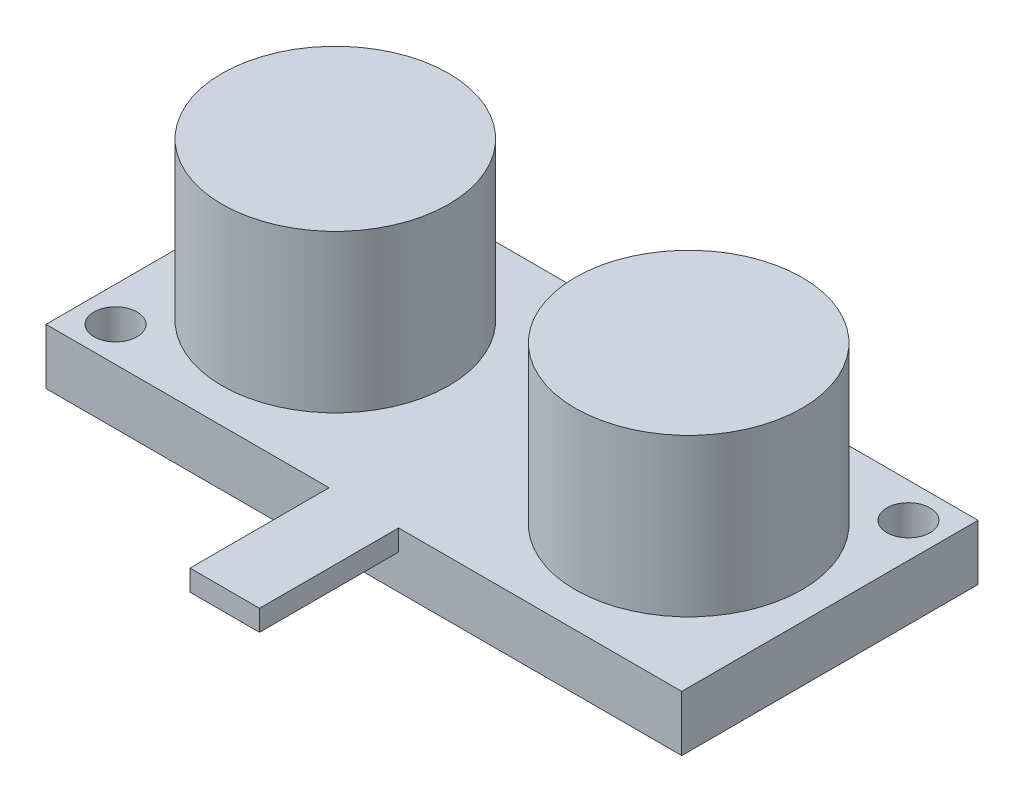
ISO-10303-21;
HEADER;
FILE_DESCRIPTION(('STEP AP214'),'2;1');
FILE_NAME('part.step','',(''),(''),'','','');
FILE_SCHEMA(('AUTOMOTIVE_DESIGN { 1 0 10303 214 1 1 1 1 }'));
ENDSEC;
DATA;
#1=APPLICATION_CONTEXT('core data for automotive mechanical design processes');
#2=APPLICATION_PROTOCOL_DEFINITION('international standard','automotive_design',2000,#1);
#3=PRODUCT_CONTEXT('',#1,'mechanical');
#4=PRODUCT('Part','Part','',(#3));
#5=PRODUCT_RELATED_PRODUCT_CATEGORY('part','',(#4));
#6=PRODUCT_DEFINITION_FORMATION('','',#4);
#7=PRODUCT_DEFINITION_CONTEXT('part definition',#1,'design');
#8=PRODUCT_DEFINITION('design','',#6,#7);
#9=PRODUCT_DEFINITION_SHAPE('','',#8);
#10=(LENGTH_UNIT() NAMED_UNIT(*) SI_UNIT(.MILLI.,.METRE.));
#11=(NAMED_UNIT(*) PLANE_ANGLE_UNIT() SI_UNIT($,.RADIAN.));
#12=(NAMED_UNIT(*) SI_UNIT($,.STERADIAN.) SOLID_ANGLE_UNIT());
#13=UNCERTAINTY_MEASURE_WITH_UNIT(LENGTH_MEASURE(1.E-05),#10,'distance_accuracy_value','');
#14=(GEOMETRIC_REPRESENTATION_CONTEXT(3) GLOBAL_UNCERTAINTY_ASSIGNED_CONTEXT((#13)) GLOBAL_UNIT_ASSIGNED_CONTEXT((#10,
#11,#12)) REPRESENTATION_CONTEXT('',''));
#15=CARTESIAN_POINT('',(0.,0.,0.));
#16=DIRECTION('',(0.,0.,1.));
#17=DIRECTION('',(1.,0.,0.));
#18=AXIS2_PLACEMENT_3D('',#15,#16,#17);
#19=CARTESIAN_POINT('',(0.,4.,0.));
#20=DIRECTION('',(0.,0.,-1.));
#21=DIRECTION('',(-1.,0.,0.));
#22=AXIS2_PLACEMENT_3D('',#19,#20,#21);
#23=PLANE('',#22);
#24=DIRECTION('',(0.,-1.,0.));
#25=VECTOR('',#24,1.);
#26=CARTESIAN_POINT('',(20.35,2.5,0.));
#27=LINE('',#26,#25);
#28=CARTESIAN_POINT('',(20.35,4.,0.));
#29=VERTEX_POINT('',#28);
#30=CARTESIAN_POINT('',(20.35,2.5,0.));
#31=VERTEX_POINT('',#30);
#32=EDGE_CURVE('E120',#29,#31,#27,.T.);
#33=ORIENTED_EDGE('',*,*,#32,.F.);
#34=DIRECTION('',(1.,0.,0.));
#35=VECTOR('',#34,1.);
#36=CARTESIAN_POINT('',(0.,4.,0.));
#37=LINE('',#36,#35);
#38=CARTESIAN_POINT('',(0.,4.,0.));
#39=VERTEX_POINT('',#38);
#40=EDGE_CURVE('E163',#39,#29,#37,.T.);
#41=ORIENTED_EDGE('',*,*,#40,.F.);
#42=DIRECTION('',(0.,-1.,0.));
#43=VECTOR('',#42,1.);
#44=CARTESIAN_POINT('',(0.,4.,0.));
#45=LINE('',#44,#43);
#46=CARTESIAN_POINT('',(0.,0.,0.));
#47=VERTEX_POINT('',#46);
#48=EDGE_CURVE('E11',#39,#47,#45,.T.);
#49=ORIENTED_EDGE('',*,*,#48,.T.);
#50=DIRECTION('',(1.,0.,0.));
#51=VECTOR('',#50,1.);
#52=CARTESIAN_POINT('',(0.,0.,0.));
#53=LINE('',#52,#51);
#54=CARTESIAN_POINT('',(45.7,0.,0.));
#55=VERTEX_POINT('',#54);
#56=EDGE_CURVE('E178',#47,#55,#53,.T.);
#57=ORIENTED_EDGE('',*,*,#56,.T.);
#58=DIRECTION('',(0.,-1.,0.));
#59=VECTOR('',#58,1.);
#60=CARTESIAN_POINT('',(45.7,4.,0.));
#61=LINE('',#60,#59);
#62=CARTESIAN_POINT('',(45.7,4.,0.));
#63=VERTEX_POINT('',#62);
#64=EDGE_CURVE('E41',#63,#55,#61,.T.);
#65=ORIENTED_EDGE('',*,*,#64,.F.);
#66=CARTESIAN_POINT('',(25.35,4.,0.));
#67=VERTEX_POINT('',#66);
#68=EDGE_CURVE('E55',#67,#63,#37,.T.);
#69=ORIENTED_EDGE('',*,*,#68,.F.);
#70=DIRECTION('',(0.,1.,0.));
#71=VECTOR('',#70,1.);
#72=CARTESIAN_POINT('',(25.35,4.,0.));
#73=LINE('',#72,#71);
#74=CARTESIAN_POINT('',(25.35,2.5,0.));
#75=VERTEX_POINT('',#74);
#76=EDGE_CURVE('E117',#75,#67,#73,.T.);
#77=ORIENTED_EDGE('',*,*,#76,.F.);
#78=DIRECTION('',(1.,0.,0.));
#79=VECTOR('',#78,1.);
#80=CARTESIAN_POINT('',(25.35,2.5,0.));
#81=LINE('',#80,#79);
#82=EDGE_CURVE('E49',#31,#75,#81,.T.);
#83=ORIENTED_EDGE('',*,*,#82,.F.);
#84=EDGE_LOOP('',(#33,#41,#49,#57,#65,#69,#77,#83));
#85=FACE_BOUND('',#84,.T.);
#86=ADVANCED_FACE('F32',(#85),#23,.F.);
#87=CARTESIAN_POINT('',(0.,4.,0.));
#88=DIRECTION('',(0.,1.,0.));
#89=DIRECTION('',(0.,0.,1.));
#90=AXIS2_PLACEMENT_3D('',#87,#88,#89);
#91=PLANE('',#90);
#92=CARTESIAN_POINT('',(35.55,4.,-10.65));
#93=DIRECTION('',(0.,1.,0.));
#94=DIRECTION('',(0.,0.,1.));
#95=AXIS2_PLACEMENT_3D('',#92,#93,#94);
#96=CIRCLE('',#95,8.15);
#97=CARTESIAN_POINT('',(35.55,4.,-18.8));
#98=VERTEX_POINT('',#97);
#99=EDGE_CURVE('E131',#98,#98,#96,.T.);
#100=ORIENTED_EDGE('',*,*,#99,.F.);
#101=EDGE_LOOP('',(#100));
#102=FACE_BOUND('',#101,.T.);
#103=CARTESIAN_POINT('',(43.2,4.,-18.8));
#104=DIRECTION('',(0.,1.,0.));
#105=DIRECTION('',(0.,0.,1.));
#106=AXIS2_PLACEMENT_3D('',#103,#104,#105);
#107=CIRCLE('',#106,1.55);
#108=CARTESIAN_POINT('',(43.2,4.,-17.25));
#109=VERTEX_POINT('',#108);
#110=EDGE_CURVE('E145',#109,#109,#107,.T.);
#111=ORIENTED_EDGE('',*,*,#110,.F.);
#112=EDGE_LOOP('',(#111));
#113=FACE_BOUND('',#112,.T.);
#114=DIRECTION('',(0.,0.,1.));
#115=VECTOR('',#114,1.);
#116=CARTESIAN_POINT('',(0.,4.,-21.3));
#117=LINE('',#116,#115);
#118=CARTESIAN_POINT('',(0.,4.,-21.3));
#119=VERTEX_POINT('',#118);
#120=EDGE_CURVE('E151',#119,#39,#117,.T.);
#121=ORIENTED_EDGE('',*,*,#120,.T.);
#122=ORIENTED_EDGE('',*,*,#40,.T.);
#123=DIRECTION('',(0.,0.,-1.));
#124=VECTOR('',#123,1.);
#125=CARTESIAN_POINT('',(20.35,4.,10.));
#126=LINE('',#125,#124);
#127=CARTESIAN_POINT('',(20.35,4.,10.));
#128=VERTEX_POINT('',#127);
#129=EDGE_CURVE('E199',#128,#29,#126,.T.);
#130=ORIENTED_EDGE('',*,*,#129,.F.);
#131=DIRECTION('',(-1.,0.,0.));
#132=VECTOR('',#131,1.);
#133=CARTESIAN_POINT('',(20.35,4.,10.));
#134=LINE('',#133,#132);
#135=CARTESIAN_POINT('',(25.35,4.,10.));
#136=VERTEX_POINT('',#135);
#137=EDGE_CURVE('E113',#136,#128,#134,.T.);
#138=ORIENTED_EDGE('',*,*,#137,.F.);
#139=DIRECTION('',(0.,0.,-1.));
#140=VECTOR('',#139,1.);
#141=CARTESIAN_POINT('',(25.35,4.,10.));
#142=LINE('',#141,#140);
#143=EDGE_CURVE('E126',#136,#67,#142,.T.);
#144=ORIENTED_EDGE('',*,*,#143,.T.);
#145=ORIENTED_EDGE('',*,*,#68,.T.);
#146=DIRECTION('',(0.,0.,-1.));
#147=VECTOR('',#146,1.);
#148=CARTESIAN_POINT('',(45.7,4.,0.));
#149=LINE('',#148,#147);
#150=CARTESIAN_POINT('',(45.7,4.,-21.3));
#151=VERTEX_POINT('',#150);
#152=EDGE_CURVE('E157',#63,#151,#149,.T.);
#153=ORIENTED_EDGE('',*,*,#152,.T.);
#154=DIRECTION('',(-1.,0.,0.));
#155=VECTOR('',#154,1.);
#156=CARTESIAN_POINT('',(45.7,4.,-21.3));
#157=LINE('',#156,#155);
#158=EDGE_CURVE('E174',#151,#119,#157,.T.);
#159=ORIENTED_EDGE('',*,*,#158,.T.);
#160=EDGE_LOOP('',(#121,#122,#130,#138,#144,#145,#153,#159));
#161=FACE_BOUND('',#160,.T.);
#162=CARTESIAN_POINT('',(2.5,4.,-2.5));
#163=DIRECTION('',(0.,1.,0.));
#164=DIRECTION('',(0.,0.,1.));
#165=AXIS2_PLACEMENT_3D('',#162,#163,#164);
#166=CIRCLE('',#165,1.55);
#167=CARTESIAN_POINT('',(2.5,4.,-0.95));
#168=VERTEX_POINT('',#167);
#169=EDGE_CURVE('E139',#168,#168,#166,.T.);
#170=ORIENTED_EDGE('',*,*,#169,.F.);
#171=EDGE_LOOP('',(#170));
#172=FACE_BOUND('',#171,.T.);
#173=CARTESIAN_POINT('',(10.15,4.,-10.65));
#174=DIRECTION('',(0.,1.,0.));
#175=DIRECTION('',(0.,0.,1.));
#176=AXIS2_PLACEMENT_3D('',#173,#174,#175);
#177=CIRCLE('',#176,8.15);
#178=CARTESIAN_POINT('',(10.15,4.,-18.8));
#179=VERTEX_POINT('',#178);
#180=EDGE_CURVE('E121',#179,#179,#177,.T.);
#181=ORIENTED_EDGE('',*,*,#180,.F.);
#182=EDGE_LOOP('',(#181));
#183=FACE_BOUND('',#182,.T.);
#184=ADVANCED_FACE('F186',(#102,#113,#161,#172,#183),#91,.T.);
#185=CARTESIAN_POINT('',(0.,0.,0.));
#186=DIRECTION('',(0.,1.,0.));
#187=DIRECTION('',(0.,0.,1.));
#188=AXIS2_PLACEMENT_3D('',#185,#186,#187);
#189=PLANE('',#188);
#190=CARTESIAN_POINT('',(43.2,0.,-18.8));
#191=DIRECTION('',(0.,1.,0.));
#192=DIRECTION('',(0.,0.,1.));
#193=AXIS2_PLACEMENT_3D('',#190,#191,#192);
#194=CIRCLE('',#193,1.55);
#195=CARTESIAN_POINT('',(43.2,0.,-17.25));
#196=VERTEX_POINT('',#195);
#197=EDGE_CURVE('E142',#196,#196,#194,.T.);
#198=ORIENTED_EDGE('',*,*,#197,.T.);
#199=EDGE_LOOP('',(#198));
#200=FACE_BOUND('',#199,.T.);
#201=DIRECTION('',(0.,0.,1.));
#202=VECTOR('',#201,1.);
#203=CARTESIAN_POINT('',(0.,0.,-21.3));
#204=LINE('',#203,#202);
#205=CARTESIAN_POINT('',(0.,0.,-21.3));
#206=VERTEX_POINT('',#205);
#207=EDGE_CURVE('E148',#206,#47,#204,.T.);
#208=ORIENTED_EDGE('',*,*,#207,.F.);
#209=DIRECTION('',(-1.,0.,0.));
#210=VECTOR('',#209,1.);
#211=CARTESIAN_POINT('',(45.7,0.,-21.3));
#212=LINE('',#211,#210);
#213=CARTESIAN_POINT('',(45.7,0.,-21.3));
#214=VERTEX_POINT('',#213);
#215=EDGE_CURVE('E154',#214,#206,#212,.T.);
#216=ORIENTED_EDGE('',*,*,#215,.F.);
#217=DIRECTION('',(0.,0.,-1.));
#218=VECTOR('',#217,1.);
#219=CARTESIAN_POINT('',(45.7,0.,0.));
#220=LINE('',#219,#218);
#221=EDGE_CURVE('E176',#55,#214,#220,.T.);
#222=ORIENTED_EDGE('',*,*,#221,.F.);
#223=ORIENTED_EDGE('',*,*,#56,.F.);
#224=EDGE_LOOP('',(#208,#216,#222,#223));
#225=FACE_BOUND('',#224,.T.);
#226=CARTESIAN_POINT('',(2.5,0.,-2.5));
#227=DIRECTION('',(0.,1.,0.));
#228=DIRECTION('',(0.,0.,1.));
#229=AXIS2_PLACEMENT_3D('',#226,#227,#228);
#230=CIRCLE('',#229,1.55);
#231=CARTESIAN_POINT('',(2.5,0.,-0.95));
#232=VERTEX_POINT('',#231);
#233=EDGE_CURVE('E136',#232,#232,#230,.T.);
#234=ORIENTED_EDGE('',*,*,#233,.T.);
#235=EDGE_LOOP('',(#234));
#236=FACE_BOUND('',#235,.T.);
#237=ADVANCED_FACE('F217',(#200,#225,#236),#189,.F.);
#238=CARTESIAN_POINT('',(0.,4.,-21.3));
#239=DIRECTION('',(1.,0.,0.));
#240=DIRECTION('',(0.,0.,-1.));
#241=AXIS2_PLACEMENT_3D('',#238,#239,#240);
#242=PLANE('',#241);
#243=ORIENTED_EDGE('',*,*,#207,.T.);
#244=ORIENTED_EDGE('',*,*,#48,.F.);
#245=ORIENTED_EDGE('',*,*,#120,.F.);
#246=DIRECTION('',(0.,-1.,0.));
#247=VECTOR('',#246,1.);
#248=CARTESIAN_POINT('',(0.,4.,-21.3));
#249=LINE('',#248,#247);
#250=EDGE_CURVE('E171',#119,#206,#249,.T.);
#251=ORIENTED_EDGE('',*,*,#250,.T.);
#252=EDGE_LOOP('',(#243,#244,#245,#251));
#253=FACE_BOUND('',#252,.T.);
#254=ADVANCED_FACE('F34',(#253),#242,.F.);
#255=CARTESIAN_POINT('',(45.7,4.,0.));
#256=DIRECTION('',(-1.,0.,0.));
#257=DIRECTION('',(0.,0.,1.));
#258=AXIS2_PLACEMENT_3D('',#255,#256,#257);
#259=PLANE('',#258);
#260=ORIENTED_EDGE('',*,*,#221,.T.);
#261=DIRECTION('',(0.,-1.,0.));
#262=VECTOR('',#261,1.);
#263=CARTESIAN_POINT('',(45.7,4.,-21.3));
#264=LINE('',#263,#262);
#265=EDGE_CURVE('E168',#151,#214,#264,.T.);
#266=ORIENTED_EDGE('',*,*,#265,.F.);
#267=ORIENTED_EDGE('',*,*,#152,.F.);
#268=ORIENTED_EDGE('',*,*,#64,.T.);
#269=EDGE_LOOP('',(#260,#266,#267,#268));
#270=FACE_BOUND('',#269,.T.);
#271=ADVANCED_FACE('F190',(#270),#259,.F.);
#272=CARTESIAN_POINT('',(45.7,4.,-21.3));
#273=DIRECTION('',(0.,0.,1.));
#274=DIRECTION('',(1.,0.,0.));
#275=AXIS2_PLACEMENT_3D('',#272,#273,#274);
#276=PLANE('',#275);
#277=ORIENTED_EDGE('',*,*,#215,.T.);
#278=ORIENTED_EDGE('',*,*,#250,.F.);
#279=ORIENTED_EDGE('',*,*,#158,.F.);
#280=ORIENTED_EDGE('',*,*,#265,.T.);
#281=EDGE_LOOP('',(#277,#278,#279,#280));
#282=FACE_BOUND('',#281,.T.);
#283=ADVANCED_FACE('F194',(#282),#276,.F.);
#284=CARTESIAN_POINT('',(43.2,4.,-18.8));
#285=DIRECTION('',(0.,-1.,0.));
#286=DIRECTION('',(0.,0.,-1.));
#287=AXIS2_PLACEMENT_3D('',#284,#285,#286);
#288=CYLINDRICAL_SURFACE('',#287,1.55);
#289=ORIENTED_EDGE('',*,*,#110,.T.);
#290=EDGE_LOOP('',(#289));
#291=FACE_BOUND('',#290,.T.);
#292=ORIENTED_EDGE('',*,*,#197,.F.);
#293=EDGE_LOOP('',(#292));
#294=FACE_BOUND('',#293,.T.);
#295=ADVANCED_FACE('F225',(#291,#294),#288,.F.);
#296=CARTESIAN_POINT('',(2.5,4.,-2.5));
#297=DIRECTION('',(0.,-1.,0.));
#298=DIRECTION('',(0.,0.,-1.));
#299=AXIS2_PLACEMENT_3D('',#296,#297,#298);
#300=CYLINDRICAL_SURFACE('',#299,1.55);
#301=ORIENTED_EDGE('',*,*,#169,.T.);
#302=EDGE_LOOP('',(#301));
#303=FACE_BOUND('',#302,.T.);
#304=ORIENTED_EDGE('',*,*,#233,.F.);
#305=EDGE_LOOP('',(#304));
#306=FACE_BOUND('',#305,.T.);
#307=ADVANCED_FACE('F231',(#303,#306),#300,.F.);
#308=CARTESIAN_POINT('',(35.55,15.3,-10.65));
#309=DIRECTION('',(0.,-1.,0.));
#310=DIRECTION('',(0.,0.,-1.));
#311=AXIS2_PLACEMENT_3D('',#308,#309,#310);
#312=CYLINDRICAL_SURFACE('',#311,8.15);
#313=CARTESIAN_POINT('',(35.55,15.3,-10.65));
#314=DIRECTION('',(0.,1.,0.));
#315=DIRECTION('',(0.,0.,1.));
#316=AXIS2_PLACEMENT_3D('',#313,#314,#315);
#317=CIRCLE('',#316,8.15);
#318=CARTESIAN_POINT('',(35.55,15.3,-18.8));
#319=VERTEX_POINT('',#318);
#320=EDGE_CURVE('E133',#319,#319,#317,.T.);
#321=CARTESIAN_POINT('',(35.55,15.3,-18.8));
#322=CARTESIAN_POINT('',(35.55,15.1822916666667,-18.8));
#323=CARTESIAN_POINT('',(35.55,15.0645833333333,-18.8));
#324=CARTESIAN_POINT('',(35.55,14.8291666666667,-18.8));
#325=CARTESIAN_POINT('',(35.55,14.7114583333333,-18.8));
#326=CARTESIAN_POINT('',(35.55,14.4760416666667,-18.8));
#327=CARTESIAN_POINT('',(35.55,14.3583333333333,-18.8));
#328=CARTESIAN_POINT('',(35.55,14.1229166666667,-18.8));
#329=CARTESIAN_POINT('',(35.55,14.0052083333333,-18.8));
#330=CARTESIAN_POINT('',(35.55,13.7697916666667,-18.8));
#331=CARTESIAN_POINT('',(35.55,13.6520833333333,-18.8));
#332=CARTESIAN_POINT('',(35.55,13.4166666666667,-18.8));
#333=CARTESIAN_POINT('',(35.55,13.2989583333333,-18.8));
#334=CARTESIAN_POINT('',(35.55,13.0635416666667,-18.8));
#335=CARTESIAN_POINT('',(35.55,12.9458333333333,-18.8));
#336=CARTESIAN_POINT('',(35.55,12.7104166666667,-18.8));
#337=CARTESIAN_POINT('',(35.55,12.5927083333333,-18.8));
#338=CARTESIAN_POINT('',(35.55,12.3572916666667,-18.8));
#339=CARTESIAN_POINT('',(35.55,12.2395833333333,-18.8));
#340=CARTESIAN_POINT('',(35.55,12.0041666666667,-18.8));
#341=CARTESIAN_POINT('',(35.55,11.8864583333333,-18.8));
#342=CARTESIAN_POINT('',(35.55,11.6510416666667,-18.8));
#343=CARTESIAN_POINT('',(35.55,11.5333333333333,-18.8));
#344=CARTESIAN_POINT('',(35.55,11.2979166666667,-18.8));
#345=CARTESIAN_POINT('',(35.55,11.1802083333333,-18.8));
#346=CARTESIAN_POINT('',(35.55,10.9447916666667,-18.8));
#347=CARTESIAN_POINT('',(35.55,10.8270833333333,-18.8));
#348=CARTESIAN_POINT('',(35.55,10.5916666666667,-18.8));
#349=CARTESIAN_POINT('',(35.55,10.4739583333333,-18.8));
#350=CARTESIAN_POINT('',(35.55,10.2385416666667,-18.8));
#351=CARTESIAN_POINT('',(35.55,10.1208333333333,-18.8));
#352=CARTESIAN_POINT('',(35.55,9.88541666666667,-18.8));
#353=CARTESIAN_POINT('',(35.55,9.76770833333333,-18.8));
#354=CARTESIAN_POINT('',(35.55,9.53229166666667,-18.8));
#355=CARTESIAN_POINT('',(35.55,9.41458333333333,-18.8));
#356=CARTESIAN_POINT('',(35.55,9.17916666666667,-18.8));
#357=CARTESIAN_POINT('',(35.55,9.06145833333333,-18.8));
#358=CARTESIAN_POINT('',(35.55,8.82604166666667,-18.8));
#359=CARTESIAN_POINT('',(35.55,8.70833333333333,-18.8));
#360=CARTESIAN_POINT('',(35.55,8.47291666666667,-18.8));
#361=CARTESIAN_POINT('',(35.55,8.35520833333333,-18.8));
#362=CARTESIAN_POINT('',(35.55,8.11979166666667,-18.8));
#363=CARTESIAN_POINT('',(35.55,8.00208333333333,-18.8));
#364=CARTESIAN_POINT('',(35.55,7.76666666666667,-18.8));
#365=CARTESIAN_POINT('',(35.55,7.64895833333333,-18.8));
#366=CARTESIAN_POINT('',(35.55,7.41354166666667,-18.8));
#367=CARTESIAN_POINT('',(35.55,7.29583333333333,-18.8));
#368=CARTESIAN_POINT('',(35.55,7.06041666666667,-18.8));
#369=CARTESIAN_POINT('',(35.55,6.94270833333333,-18.8));
#370=CARTESIAN_POINT('',(35.55,6.70729166666667,-18.8));
#371=CARTESIAN_POINT('',(35.55,6.58958333333333,-18.8));
#372=CARTESIAN_POINT('',(35.55,6.35416666666667,-18.8));
#373=CARTESIAN_POINT('',(35.55,6.23645833333333,-18.8));
#374=CARTESIAN_POINT('',(35.55,6.00104166666667,-18.8));
#375=CARTESIAN_POINT('',(35.55,5.88333333333333,-18.8));
#376=CARTESIAN_POINT('',(35.55,5.64791666666667,-18.8));
#377=CARTESIAN_POINT('',(35.55,5.53020833333333,-18.8));
#378=CARTESIAN_POINT('',(35.55,5.29479166666667,-18.8));
#379=CARTESIAN_POINT('',(35.55,5.17708333333333,-18.8));
#380=CARTESIAN_POINT('',(35.55,4.94166666666667,-18.8));
#381=CARTESIAN_POINT('',(35.55,4.82395833333333,-18.8));
#382=CARTESIAN_POINT('',(35.55,4.58854166666667,-18.8));
#383=CARTESIAN_POINT('',(35.55,4.47083333333333,-18.8));
#384=CARTESIAN_POINT('',(35.55,4.23541666666667,-18.8));
#385=CARTESIAN_POINT('',(35.55,4.11770833333333,-18.8));
#386=CARTESIAN_POINT('',(35.55,4.,-18.8));
#387=B_SPLINE_CURVE_WITH_KNOTS('',3,(#321,#322,#323,#324,#325,#326,#327,#328,#329,#330,#331,
#332,#333,#334,#335,#336,#337,#338,#339,#340,#341,#342,#343,#344,#345,#346,#347,#348,#349,#350,
#351,#352,#353,#354,#355,#356,#357,#358,#359,#360,#361,#362,#363,#364,#365,#366,#367,#368,#369,
#370,#371,#372,#373,#374,#375,#376,#377,#378,#379,#380,#381,#382,#383,#384,#385,#386),
.UNSPECIFIED.,.F.,.F.,(4,2,2,2,2,2,2,2,2,2,2,2,2,2,2,2,2,2,2,2,2,2,2,2,2,2,2,2,2,2,2,2,4),(0.,
0.353124999999999,0.706249999999998,1.059375,1.4125,1.765625,2.11875,2.471875,2.825,3.178125,
3.53125,3.884375,4.2375,4.590625,4.94375,5.296875,5.65,6.003125,6.35625,6.709375,7.0625,
7.415625,7.76875,8.121875,8.475,8.828125,9.18125,9.534375,9.8875,10.240625,10.59375,10.946875,
11.3),.UNSPECIFIED.);
#388=EDGE_CURVE('BSEAM235',#319,#98,#387,.T.);
#389=ORIENTED_EDGE('',*,*,#320,.F.);
#390=ORIENTED_EDGE('',*,*,#99,.T.);
#391=ORIENTED_EDGE('',*,*,#388,.T.);
#392=ORIENTED_EDGE('',*,*,#388,.F.);
#393=EDGE_LOOP('',(#389,#391,#390,#392));
#394=FACE_BOUND('',#393,.T.);
#395=ADVANCED_FACE('F235',(#394),#312,.T.);
#396=CARTESIAN_POINT('',(35.55,15.3,-10.65));
#397=DIRECTION('',(0.,1.,0.));
#398=DIRECTION('',(0.,0.,1.));
#399=AXIS2_PLACEMENT_3D('',#396,#397,#398);
#400=PLANE('',#399);
#401=ORIENTED_EDGE('',*,*,#320,.T.);
#402=EDGE_LOOP('',(#401));
#403=FACE_BOUND('',#402,.T.);
#404=ADVANCED_FACE('F239',(#403),#400,.T.);
#405=CARTESIAN_POINT('',(10.15,15.3,-10.65));
#406=DIRECTION('',(0.,-1.,0.));
#407=DIRECTION('',(0.,0.,-1.));
#408=AXIS2_PLACEMENT_3D('',#405,#406,#407);
#409=CYLINDRICAL_SURFACE('',#408,8.15);
#410=CARTESIAN_POINT('',(10.15,15.3,-10.65));
#411=DIRECTION('',(0.,1.,0.));
#412=DIRECTION('',(0.,0.,1.));
#413=AXIS2_PLACEMENT_3D('',#410,#411,#412);
#414=CIRCLE('',#413,8.15);
#415=CARTESIAN_POINT('',(10.15,15.3,-18.8));
#416=VERTEX_POINT('',#415);
#417=EDGE_CURVE('E124',#416,#416,#414,.T.);
#418=CARTESIAN_POINT('',(10.15,15.3,-18.8));
#419=CARTESIAN_POINT('',(10.15,15.1822916666667,-18.8));
#420=CARTESIAN_POINT('',(10.15,15.0645833333333,-18.8));
#421=CARTESIAN_POINT('',(10.15,14.8291666666667,-18.8));
#422=CARTESIAN_POINT('',(10.15,14.7114583333333,-18.8));
#423=CARTESIAN_POINT('',(10.15,14.4760416666667,-18.8));
#424=CARTESIAN_POINT('',(10.15,14.3583333333333,-18.8));
#425=CARTESIAN_POINT('',(10.15,14.1229166666667,-18.8));
#426=CARTESIAN_POINT('',(10.15,14.0052083333333,-18.8));
#427=CARTESIAN_POINT('',(10.15,13.7697916666667,-18.8));
#428=CARTESIAN_POINT('',(10.15,13.6520833333333,-18.8));
#429=CARTESIAN_POINT('',(10.15,13.4166666666667,-18.8));
#430=CARTESIAN_POINT('',(10.15,13.2989583333333,-18.8));
#431=CARTESIAN_POINT('',(10.15,13.0635416666667,-18.8));
#432=CARTESIAN_POINT('',(10.15,12.9458333333333,-18.8));
#433=CARTESIAN_POINT('',(10.15,12.7104166666667,-18.8));
#434=CARTESIAN_POINT('',(10.15,12.5927083333333,-18.8));
#435=CARTESIAN_POINT('',(10.15,12.3572916666667,-18.8));
#436=CARTESIAN_POINT('',(10.15,12.2395833333333,-18.8));
#437=CARTESIAN_POINT('',(10.15,12.0041666666667,-18.8));
#438=CARTESIAN_POINT('',(10.15,11.8864583333333,-18.8));
#439=CARTESIAN_POINT('',(10.15,11.6510416666667,-18.8));
#440=CARTESIAN_POINT('',(10.15,11.5333333333333,-18.8));
#441=CARTESIAN_POINT('',(10.15,11.2979166666667,-18.8));
#442=CARTESIAN_POINT('',(10.15,11.1802083333333,-18.8));
#443=CARTESIAN_POINT('',(10.15,10.9447916666667,-18.8));
#444=CARTESIAN_POINT('',(10.15,10.8270833333333,-18.8));
#445=CARTESIAN_POINT('',(10.15,10.5916666666667,-18.8));
#446=CARTESIAN_POINT('',(10.15,10.4739583333333,-18.8));
#447=CARTESIAN_POINT('',(10.15,10.2385416666667,-18.8));
#448=CARTESIAN_POINT('',(10.15,10.1208333333333,-18.8));
#449=CARTESIAN_POINT('',(10.15,9.88541666666667,-18.8));
#450=CARTESIAN_POINT('',(10.15,9.76770833333333,-18.8));
#451=CARTESIAN_POINT('',(10.15,9.53229166666667,-18.8));
#452=CARTESIAN_POINT('',(10.15,9.41458333333333,-18.8));
#453=CARTESIAN_POINT('',(10.15,9.17916666666667,-18.8));
#454=CARTESIAN_POINT('',(10.15,9.06145833333333,-18.8));
#455=CARTESIAN_POINT('',(10.15,8.82604166666667,-18.8));
#456=CARTESIAN_POINT('',(10.15,8.70833333333333,-18.8));
#457=CARTESIAN_POINT('',(10.15,8.47291666666667,-18.8));
#458=CARTESIAN_POINT('',(10.15,8.35520833333333,-18.8));
#459=CARTESIAN_POINT('',(10.15,8.11979166666667,-18.8));
#460=CARTESIAN_POINT('',(10.15,8.00208333333333,-18.8));
#461=CARTESIAN_POINT('',(10.15,7.76666666666667,-18.8));
#462=CARTESIAN_POINT('',(10.15,7.64895833333333,-18.8));
#463=CARTESIAN_POINT('',(10.15,7.41354166666667,-18.8));
#464=CARTESIAN_POINT('',(10.15,7.29583333333333,-18.8));
#465=CARTESIAN_POINT('',(10.15,7.06041666666667,-18.8));
#466=CARTESIAN_POINT('',(10.15,6.94270833333333,-18.8));
#467=CARTESIAN_POINT('',(10.15,6.70729166666667,-18.8));
#468=CARTESIAN_POINT('',(10.15,6.58958333333333,-18.8));
#469=CARTESIAN_POINT('',(10.15,6.35416666666667,-18.8));
#470=CARTESIAN_POINT('',(10.15,6.23645833333333,-18.8));
#471=CARTESIAN_POINT('',(10.15,6.00104166666667,-18.8));
#472=CARTESIAN_POINT('',(10.15,5.88333333333333,-18.8));
#473=CARTESIAN_POINT('',(10.15,5.64791666666667,-18.8));
#474=CARTESIAN_POINT('',(10.15,5.53020833333333,-18.8));
#475=CARTESIAN_POINT('',(10.15,5.29479166666667,-18.8));
#476=CARTESIAN_POINT('',(10.15,5.17708333333333,-18.8));
#477=CARTESIAN_POINT('',(10.15,4.94166666666667,-18.8));
#478=CARTESIAN_POINT('',(10.15,4.82395833333333,-18.8));
#479=CARTESIAN_POINT('',(10.15,4.58854166666667,-18.8));
#480=CARTESIAN_POINT('',(10.15,4.47083333333333,-18.8));
#481=CARTESIAN_POINT('',(10.15,4.23541666666667,-18.8));
#482=CARTESIAN_POINT('',(10.15,4.11770833333333,-18.8));
#483=CARTESIAN_POINT('',(10.15,4.,-18.8));
#484=B_SPLINE_CURVE_WITH_KNOTS('',3,(#418,#419,#420,#421,#422,#423,#424,#425,#426,#427,#428,
#429,#430,#431,#432,#433,#434,#435,#436,#437,#438,#439,#440,#441,#442,#443,#444,#445,#446,#447,
#448,#449,#450,#451,#452,#453,#454,#455,#456,#457,#458,#459,#460,#461,#462,#463,#464,#465,#466,
#467,#468,#469,#470,#471,#472,#473,#474,#475,#476,#477,#478,#479,#480,#481,#482,#483),
.UNSPECIFIED.,.F.,.F.,(4,2,2,2,2,2,2,2,2,2,2,2,2,2,2,2,2,2,2,2,2,2,2,2,2,2,2,2,2,2,2,2,4),(0.,
0.353124999999999,0.706249999999998,1.059375,1.4125,1.765625,2.11875,2.471875,2.825,3.178125,
3.53125,3.884375,4.2375,4.590625,4.94375,5.296875,5.65,6.003125,6.35625,6.709375,7.0625,
7.415625,7.76875,8.121875,8.475,8.828125,9.18125,9.534375,9.8875,10.240625,10.59375,10.946875,
11.3),.UNSPECIFIED.);
#485=EDGE_CURVE('BSEAM243',#416,#179,#484,.T.);
#486=ORIENTED_EDGE('',*,*,#417,.F.);
#487=ORIENTED_EDGE('',*,*,#180,.T.);
#488=ORIENTED_EDGE('',*,*,#485,.T.);
#489=ORIENTED_EDGE('',*,*,#485,.F.);
#490=EDGE_LOOP('',(#486,#488,#487,#489));
#491=FACE_BOUND('',#490,.T.);
#492=ADVANCED_FACE('F243',(#491),#409,.T.);
#493=CARTESIAN_POINT('',(10.15,15.3,-10.65));
#494=DIRECTION('',(0.,1.,0.));
#495=DIRECTION('',(0.,0.,1.));
#496=AXIS2_PLACEMENT_3D('',#493,#494,#495);
#497=PLANE('',#496);
#498=ORIENTED_EDGE('',*,*,#417,.T.);
#499=EDGE_LOOP('',(#498));
#500=FACE_BOUND('',#499,.T.);
#501=ADVANCED_FACE('F247',(#500),#497,.T.);
#502=CARTESIAN_POINT('',(20.35,2.5,10.));
#503=DIRECTION('',(1.,0.,0.));
#504=DIRECTION('',(0.,0.,-1.));
#505=AXIS2_PLACEMENT_3D('',#502,#503,#504);
#506=PLANE('',#505);
#507=ORIENTED_EDGE('',*,*,#32,.T.);
#508=DIRECTION('',(0.,0.,-1.));
#509=VECTOR('',#508,1.);
#510=CARTESIAN_POINT('',(20.35,2.5,10.));
#511=LINE('',#510,#509);
#512=CARTESIAN_POINT('',(20.35,2.5,10.));
#513=VERTEX_POINT('',#512);
#514=EDGE_CURVE('E101',#513,#31,#511,.T.);
#515=ORIENTED_EDGE('',*,*,#514,.F.);
#516=DIRECTION('',(0.,-1.,0.));
#517=VECTOR('',#516,1.);
#518=CARTESIAN_POINT('',(20.35,2.5,10.));
#519=LINE('',#518,#517);
#520=EDGE_CURVE('E108',#128,#513,#519,.T.);
#521=ORIENTED_EDGE('',*,*,#520,.F.);
#522=ORIENTED_EDGE('',*,*,#129,.T.);
#523=EDGE_LOOP('',(#507,#515,#521,#522));
#524=FACE_BOUND('',#523,.T.);
#525=ADVANCED_FACE('F119',(#524),#506,.F.);
#526=CARTESIAN_POINT('',(25.35,2.5,10.));
#527=DIRECTION('',(0.,1.,0.));
#528=DIRECTION('',(0.,0.,1.));
#529=AXIS2_PLACEMENT_3D('',#526,#527,#528);
#530=PLANE('',#529);
#531=ORIENTED_EDGE('',*,*,#82,.T.);
#532=DIRECTION('',(0.,0.,-1.));
#533=VECTOR('',#532,1.);
#534=CARTESIAN_POINT('',(25.35,2.5,10.));
#535=LINE('',#534,#533);
#536=CARTESIAN_POINT('',(25.35,2.5,10.));
#537=VERTEX_POINT('',#536);
#538=EDGE_CURVE('E104',#537,#75,#535,.T.);
#539=ORIENTED_EDGE('',*,*,#538,.F.);
#540=DIRECTION('',(1.,0.,0.));
#541=VECTOR('',#540,1.);
#542=CARTESIAN_POINT('',(25.35,2.5,10.));
#543=LINE('',#542,#541);
#544=EDGE_CURVE('E97',#513,#537,#543,.T.);
#545=ORIENTED_EDGE('',*,*,#544,.F.);
#546=ORIENTED_EDGE('',*,*,#514,.T.);
#547=EDGE_LOOP('',(#531,#539,#545,#546));
#548=FACE_BOUND('',#547,.T.);
#549=ADVANCED_FACE('F99',(#548),#530,.F.);
#550=CARTESIAN_POINT('',(25.35,4.,10.));
#551=DIRECTION('',(-1.,0.,0.));
#552=DIRECTION('',(0.,0.,1.));
#553=AXIS2_PLACEMENT_3D('',#550,#551,#552);
#554=PLANE('',#553);
#555=ORIENTED_EDGE('',*,*,#76,.T.);
#556=ORIENTED_EDGE('',*,*,#143,.F.);
#557=DIRECTION('',(0.,1.,0.));
#558=VECTOR('',#557,1.);
#559=CARTESIAN_POINT('',(25.35,4.,10.));
#560=LINE('',#559,#558);
#561=EDGE_CURVE('E107',#537,#136,#560,.T.);
#562=ORIENTED_EDGE('',*,*,#561,.F.);
#563=ORIENTED_EDGE('',*,*,#538,.T.);
#564=EDGE_LOOP('',(#555,#556,#562,#563));
#565=FACE_BOUND('',#564,.T.);
#566=ADVANCED_FACE('F212',(#565),#554,.F.);
#567=CARTESIAN_POINT('',(20.35,4.,10.));
#568=DIRECTION('',(0.,0.,-1.));
#569=DIRECTION('',(-1.,0.,0.));
#570=AXIS2_PLACEMENT_3D('',#567,#568,#569);
#571=PLANE('',#570);
#572=ORIENTED_EDGE('',*,*,#520,.T.);
#573=ORIENTED_EDGE('',*,*,#544,.T.);
#574=ORIENTED_EDGE('',*,*,#561,.T.);
#575=ORIENTED_EDGE('',*,*,#137,.T.);
#576=EDGE_LOOP('',(#572,#573,#574,#575));
#577=FACE_BOUND('',#576,.T.);
#578=ADVANCED_FACE('F111',(#577),#571,.F.);
#579=CLOSED_SHELL('',(#86,#184,#237,#254,#271,#283,#295,#307,#395,#404,#492,#501,#525,#549,#566,#578));
#580=MANIFOLD_SOLID_BREP('B2',#579);
#581=ADVANCED_BREP_SHAPE_REPRESENTATION('',(#18,#580),#14);
#582=SHAPE_DEFINITION_REPRESENTATION(#9,#581);
ENDSEC;
END-ISO-10303-21;
